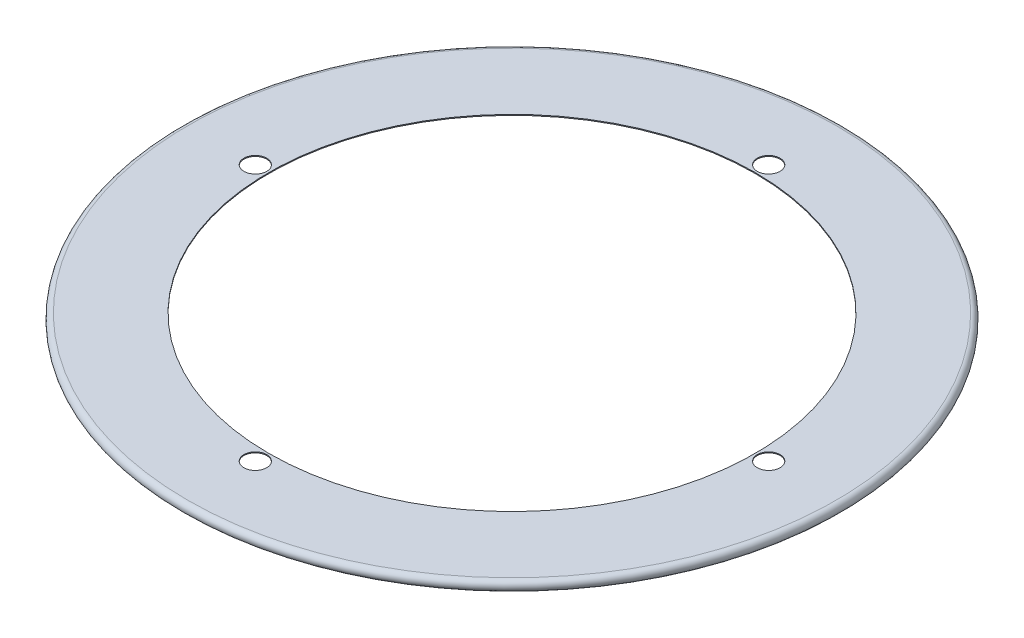
ISO-10303-21;
HEADER;
FILE_DESCRIPTION(('STEP AP214'),'2;1');
FILE_NAME('part.step','',(''),(''),'','','');
FILE_SCHEMA(('AUTOMOTIVE_DESIGN { 1 0 10303 214 1 1 1 1 }'));
ENDSEC;
DATA;
#1=APPLICATION_CONTEXT('core data for automotive mechanical design processes');
#2=APPLICATION_PROTOCOL_DEFINITION('international standard','automotive_design',2000,#1);
#3=PRODUCT_CONTEXT('',#1,'mechanical');
#4=PRODUCT('Part','Part','',(#3));
#5=PRODUCT_RELATED_PRODUCT_CATEGORY('part','',(#4));
#6=PRODUCT_DEFINITION_FORMATION('','',#4);
#7=PRODUCT_DEFINITION_CONTEXT('part definition',#1,'design');
#8=PRODUCT_DEFINITION('design','',#6,#7);
#9=PRODUCT_DEFINITION_SHAPE('','',#8);
#10=(LENGTH_UNIT() NAMED_UNIT(*) SI_UNIT(.MILLI.,.METRE.));
#11=(NAMED_UNIT(*) PLANE_ANGLE_UNIT() SI_UNIT($,.RADIAN.));
#12=(NAMED_UNIT(*) SI_UNIT($,.STERADIAN.) SOLID_ANGLE_UNIT());
#13=UNCERTAINTY_MEASURE_WITH_UNIT(LENGTH_MEASURE(1.E-05),#10,'distance_accuracy_value','');
#14=(GEOMETRIC_REPRESENTATION_CONTEXT(3) GLOBAL_UNCERTAINTY_ASSIGNED_CONTEXT((#13)) GLOBAL_UNIT_ASSIGNED_CONTEXT((#10,
#11,#12)) REPRESENTATION_CONTEXT('',''));
#15=CARTESIAN_POINT('',(0.,0.,0.));
#16=DIRECTION('',(0.,0.,1.));
#17=DIRECTION('',(1.,0.,0.));
#18=AXIS2_PLACEMENT_3D('',#15,#16,#17);
#19=CARTESIAN_POINT('',(152.4,0.,0.));
#20=DIRECTION('',(0.,1.,0.));
#21=DIRECTION('',(0.,0.,1.));
#22=AXIS2_PLACEMENT_3D('',#19,#20,#21);
#23=TOROIDAL_SURFACE('',#22,152.4,2.4638);
#24=CARTESIAN_POINT('',(152.4,-2.4638,0.));
#25=DIRECTION('',(0.,1.,0.));
#26=DIRECTION('',(0.,0.,1.));
#27=AXIS2_PLACEMENT_3D('',#24,#25,#26);
#28=CIRCLE('',#27,152.4);
#29=CARTESIAN_POINT('',(152.4,-2.4638,152.4));
#30=VERTEX_POINT('',#29);
#31=EDGE_CURVE('E12',#30,#30,#28,.T.);
#32=ORIENTED_EDGE('',*,*,#31,.T.);
#33=EDGE_LOOP('',(#32));
#34=FACE_BOUND('',#33,.T.);
#35=CARTESIAN_POINT('',(152.4,2.4638,0.));
#36=DIRECTION('',(0.,1.,0.));
#37=DIRECTION('',(0.,0.,1.));
#38=AXIS2_PLACEMENT_3D('',#35,#36,#37);
#39=CIRCLE('',#38,152.4);
#40=CARTESIAN_POINT('',(152.4,2.4638,152.4));
#41=VERTEX_POINT('',#40);
#42=EDGE_CURVE('E70',#41,#41,#39,.T.);
#43=ORIENTED_EDGE('',*,*,#42,.F.);
#44=EDGE_LOOP('',(#43));
#45=FACE_BOUND('',#44,.T.);
#46=ADVANCED_FACE('F42',(#34,#45),#23,.T.);
#47=CARTESIAN_POINT('',(14.9024415187753,-2.4638,0.));
#48=DIRECTION('',(0.,-1.,0.));
#49=DIRECTION('',(0.,0.,-1.));
#50=AXIS2_PLACEMENT_3D('',#47,#48,#49);
#51=PLANE('',#50);
#52=CARTESIAN_POINT('',(152.4,-2.4638,0.));
#53=DIRECTION('',(0.,1.,0.));
#54=DIRECTION('',(0.,0.,1.));
#55=AXIS2_PLACEMENT_3D('',#52,#53,#54);
#56=CIRCLE('',#55,137.497558481225);
#57=CARTESIAN_POINT('',(152.4,-2.4638,137.497558481225));
#58=VERTEX_POINT('',#57);
#59=EDGE_CURVE('E48',#58,#58,#56,.T.);
#60=ORIENTED_EDGE('',*,*,#59,.T.);
#61=EDGE_LOOP('',(#60));
#62=FACE_BOUND('',#61,.T.);
#63=ORIENTED_EDGE('',*,*,#31,.F.);
#64=EDGE_LOOP('',(#63));
#65=FACE_BOUND('',#64,.T.);
#66=ADVANCED_FACE('F144',(#62,#65),#51,.T.);
#67=CARTESIAN_POINT('',(152.4,15.515798554832,0.));
#68=DIRECTION('',(0.,1.,0.));
#69=DIRECTION('',(0.,0.,1.));
#70=AXIS2_PLACEMENT_3D('',#67,#68,#69);
#71=CYLINDRICAL_SURFACE('',#70,137.497558481225);
#72=CARTESIAN_POINT('',(152.4,-2.032,0.));
#73=DIRECTION('',(0.,1.,0.));
#74=DIRECTION('',(0.,0.,1.));
#75=AXIS2_PLACEMENT_3D('',#72,#73,#74);
#76=CIRCLE('',#75,137.497558481225);
#77=CARTESIAN_POINT('',(152.4,-2.032,137.497558481225));
#78=VERTEX_POINT('',#77);
#79=EDGE_CURVE('E52',#78,#78,#76,.T.);
#80=ORIENTED_EDGE('',*,*,#79,.T.);
#81=EDGE_LOOP('',(#80));
#82=FACE_BOUND('',#81,.T.);
#83=ORIENTED_EDGE('',*,*,#59,.F.);
#84=EDGE_LOOP('',(#83));
#85=FACE_BOUND('',#84,.T.);
#86=ADVANCED_FACE('F138',(#82,#85),#71,.F.);
#87=CARTESIAN_POINT('',(0.,-2.032,0.));
#88=DIRECTION('',(0.,1.,0.));
#89=DIRECTION('',(0.,0.,1.));
#90=AXIS2_PLACEMENT_3D('',#87,#88,#89);
#91=PLANE('',#90);
#92=CARTESIAN_POINT('',(152.4,-2.032,0.));
#93=DIRECTION('',(0.,1.,0.));
#94=DIRECTION('',(0.,0.,1.));
#95=AXIS2_PLACEMENT_3D('',#92,#93,#94);
#96=CIRCLE('',#95,152.4);
#97=CARTESIAN_POINT('',(152.4,-2.032,152.4));
#98=VERTEX_POINT('',#97);
#99=EDGE_CURVE('E56',#98,#98,#96,.T.);
#100=ORIENTED_EDGE('',*,*,#99,.T.);
#101=EDGE_LOOP('',(#100));
#102=FACE_BOUND('',#101,.T.);
#103=ORIENTED_EDGE('',*,*,#79,.F.);
#104=EDGE_LOOP('',(#103));
#105=FACE_BOUND('',#104,.T.);
#106=ADVANCED_FACE('F132',(#102,#105),#91,.T.);
#107=CARTESIAN_POINT('',(152.4,0.,0.));
#108=DIRECTION('',(0.,1.,0.));
#109=DIRECTION('',(0.,0.,1.));
#110=AXIS2_PLACEMENT_3D('',#107,#108,#109);
#111=TOROIDAL_SURFACE('',#110,152.4,2.032);
#112=CARTESIAN_POINT('',(152.4,2.032,0.));
#113=DIRECTION('',(0.,1.,0.));
#114=DIRECTION('',(0.,0.,1.));
#115=AXIS2_PLACEMENT_3D('',#112,#113,#114);
#116=CIRCLE('',#115,152.4);
#117=CARTESIAN_POINT('',(152.4,2.032,152.4));
#118=VERTEX_POINT('',#117);
#119=EDGE_CURVE('E61',#118,#118,#116,.T.);
#120=ORIENTED_EDGE('',*,*,#119,.T.);
#121=EDGE_LOOP('',(#120));
#122=FACE_BOUND('',#121,.T.);
#123=ORIENTED_EDGE('',*,*,#99,.F.);
#124=EDGE_LOOP('',(#123));
#125=FACE_BOUND('',#124,.T.);
#126=ADVANCED_FACE('F125',(#122,#125),#111,.F.);
#127=CARTESIAN_POINT('',(38.1,2.032,0.));
#128=DIRECTION('',(0.,-1.,0.));
#129=DIRECTION('',(0.,0.,-1.));
#130=AXIS2_PLACEMENT_3D('',#127,#128,#129);
#131=PLANE('',#130);
#132=CARTESIAN_POINT('',(273.016731480064,2.032,8.32770495544304E-13));
#133=DIRECTION('',(0.,-1.,0.));
#134=DIRECTION('',(0.,0.,-1.));
#135=AXIS2_PLACEMENT_3D('',#132,#133,#134);
#136=CIRCLE('',#135,5.36003335574986);
#137=CARTESIAN_POINT('',(273.016731480064,2.032,-5.36003335574903));
#138=VERTEX_POINT('',#137);
#139=EDGE_CURVE('E79',#138,#138,#136,.F.);
#140=ORIENTED_EDGE('',*,*,#139,.T.);
#141=EDGE_LOOP('',(#140));
#142=FACE_BOUND('',#141,.T.);
#143=CARTESIAN_POINT('',(152.4,2.032,-120.616731480064));
#144=DIRECTION('',(0.,-1.,0.));
#145=DIRECTION('',(0.,0.,-1.));
#146=AXIS2_PLACEMENT_3D('',#143,#144,#145);
#147=CIRCLE('',#146,5.36003335574987);
#148=CARTESIAN_POINT('',(152.4,2.032,-125.976764835814));
#149=VERTEX_POINT('',#148);
#150=EDGE_CURVE('E87',#149,#149,#147,.F.);
#151=ORIENTED_EDGE('',*,*,#150,.T.);
#152=EDGE_LOOP('',(#151));
#153=FACE_BOUND('',#152,.T.);
#154=CARTESIAN_POINT('',(152.399999999999,2.032,120.616731480064));
#155=DIRECTION('',(0.,-1.,0.));
#156=DIRECTION('',(0.,0.,-1.));
#157=AXIS2_PLACEMENT_3D('',#154,#155,#156);
#158=CIRCLE('',#157,5.36003335574987);
#159=CARTESIAN_POINT('',(152.399999999999,2.032,115.256698124314));
#160=VERTEX_POINT('',#159);
#161=EDGE_CURVE('E80',#160,#160,#158,.F.);
#162=ORIENTED_EDGE('',*,*,#161,.T.);
#163=EDGE_LOOP('',(#162));
#164=FACE_BOUND('',#163,.T.);
#165=CARTESIAN_POINT('',(31.7832685199361,2.032,0.));
#166=DIRECTION('',(0.,-1.,0.));
#167=DIRECTION('',(0.,0.,-1.));
#168=AXIS2_PLACEMENT_3D('',#165,#166,#167);
#169=CIRCLE('',#168,5.36003335574986);
#170=CARTESIAN_POINT('',(31.7832685199361,2.032,-5.36003335574986));
#171=VERTEX_POINT('',#170);
#172=EDGE_CURVE('E73',#171,#171,#169,.F.);
#173=ORIENTED_EDGE('',*,*,#172,.T.);
#174=EDGE_LOOP('',(#173));
#175=FACE_BOUND('',#174,.T.);
#176=CARTESIAN_POINT('',(152.4,2.032,0.));
#177=DIRECTION('',(0.,1.,0.));
#178=DIRECTION('',(0.,0.,1.));
#179=AXIS2_PLACEMENT_3D('',#176,#177,#178);
#180=CIRCLE('',#179,114.3);
#181=CARTESIAN_POINT('',(152.4,2.032,114.3));
#182=VERTEX_POINT('',#181);
#183=EDGE_CURVE('E64',#182,#182,#180,.T.);
#184=ORIENTED_EDGE('',*,*,#183,.T.);
#185=EDGE_LOOP('',(#184));
#186=FACE_BOUND('',#185,.T.);
#187=ORIENTED_EDGE('',*,*,#119,.F.);
#188=EDGE_LOOP('',(#187));
#189=FACE_BOUND('',#188,.T.);
#190=ADVANCED_FACE('F119',(#142,#153,#164,#175,#186,#189),#131,.T.);
#191=CARTESIAN_POINT('',(152.4,15.515798554832,0.));
#192=DIRECTION('',(0.,1.,0.));
#193=DIRECTION('',(0.,0.,1.));
#194=AXIS2_PLACEMENT_3D('',#191,#192,#193);
#195=CYLINDRICAL_SURFACE('',#194,114.3);
#196=CARTESIAN_POINT('',(152.4,2.4638,0.));
#197=DIRECTION('',(0.,1.,0.));
#198=DIRECTION('',(0.,0.,1.));
#199=AXIS2_PLACEMENT_3D('',#196,#197,#198);
#200=CIRCLE('',#199,114.3);
#201=CARTESIAN_POINT('',(152.4,2.4638,114.3));
#202=VERTEX_POINT('',#201);
#203=EDGE_CURVE('E67',#202,#202,#200,.T.);
#204=ORIENTED_EDGE('',*,*,#203,.T.);
#205=EDGE_LOOP('',(#204));
#206=FACE_BOUND('',#205,.T.);
#207=ORIENTED_EDGE('',*,*,#183,.F.);
#208=EDGE_LOOP('',(#207));
#209=FACE_BOUND('',#208,.T.);
#210=ADVANCED_FACE('F105',(#206,#209),#195,.F.);
#211=CARTESIAN_POINT('',(0.,2.4638,0.));
#212=DIRECTION('',(0.,1.,0.));
#213=DIRECTION('',(0.,0.,1.));
#214=AXIS2_PLACEMENT_3D('',#211,#212,#213);
#215=PLANE('',#214);
#216=CARTESIAN_POINT('',(273.016731480064,2.4638,8.32770495544304E-13));
#217=DIRECTION('',(0.,1.,0.));
#218=DIRECTION('',(0.,0.,1.));
#219=AXIS2_PLACEMENT_3D('',#216,#217,#218);
#220=CIRCLE('',#219,5.36003335574986);
#221=CARTESIAN_POINT('',(273.016731480064,2.4638,5.3600333557507));
#222=VERTEX_POINT('',#221);
#223=EDGE_CURVE('E90',#222,#222,#220,.T.);
#224=ORIENTED_EDGE('',*,*,#223,.F.);
#225=EDGE_LOOP('',(#224));
#226=FACE_BOUND('',#225,.T.);
#227=CARTESIAN_POINT('',(152.4,2.4638,-120.616731480064));
#228=DIRECTION('',(0.,1.,0.));
#229=DIRECTION('',(0.,0.,1.));
#230=AXIS2_PLACEMENT_3D('',#227,#228,#229);
#231=CIRCLE('',#230,5.36003335574987);
#232=CARTESIAN_POINT('',(152.4,2.4638,-115.256698124314));
#233=VERTEX_POINT('',#232);
#234=EDGE_CURVE('E83',#233,#233,#231,.T.);
#235=ORIENTED_EDGE('',*,*,#234,.F.);
#236=EDGE_LOOP('',(#235));
#237=FACE_BOUND('',#236,.T.);
#238=CARTESIAN_POINT('',(152.399999999999,2.4638,120.616731480064));
#239=DIRECTION('',(0.,1.,0.));
#240=DIRECTION('',(0.,0.,1.));
#241=AXIS2_PLACEMENT_3D('',#238,#239,#240);
#242=CIRCLE('',#241,5.36003335574987);
#243=CARTESIAN_POINT('',(152.399999999999,2.4638,125.976764835814));
#244=VERTEX_POINT('',#243);
#245=EDGE_CURVE('E84',#244,#244,#242,.T.);
#246=ORIENTED_EDGE('',*,*,#245,.F.);
#247=EDGE_LOOP('',(#246));
#248=FACE_BOUND('',#247,.T.);
#249=CARTESIAN_POINT('',(31.7832685199361,2.4638,0.));
#250=DIRECTION('',(0.,1.,0.));
#251=DIRECTION('',(0.,0.,1.));
#252=AXIS2_PLACEMENT_3D('',#249,#250,#251);
#253=CIRCLE('',#252,5.36003335574986);
#254=CARTESIAN_POINT('',(31.7832685199361,2.4638,5.36003335574986));
#255=VERTEX_POINT('',#254);
#256=EDGE_CURVE('E76',#255,#255,#253,.T.);
#257=ORIENTED_EDGE('',*,*,#256,.F.);
#258=EDGE_LOOP('',(#257));
#259=FACE_BOUND('',#258,.T.);
#260=ORIENTED_EDGE('',*,*,#42,.T.);
#261=EDGE_LOOP('',(#260));
#262=FACE_BOUND('',#261,.T.);
#263=ORIENTED_EDGE('',*,*,#203,.F.);
#264=EDGE_LOOP('',(#263));
#265=FACE_BOUND('',#264,.T.);
#266=ADVANCED_FACE('F101',(#226,#237,#248,#259,#262,#265),#215,.T.);
#267=CARTESIAN_POINT('',(31.7832685199361,-13.1284637329473,0.));
#268=DIRECTION('',(0.,1.,0.));
#269=DIRECTION('',(0.,0.,1.));
#270=AXIS2_PLACEMENT_3D('',#267,#268,#269);
#271=CYLINDRICAL_SURFACE('',#270,5.36003335574986);
#272=ORIENTED_EDGE('',*,*,#256,.T.);
#273=EDGE_LOOP('',(#272));
#274=FACE_BOUND('',#273,.T.);
#275=ORIENTED_EDGE('',*,*,#172,.F.);
#276=EDGE_LOOP('',(#275));
#277=FACE_BOUND('',#276,.T.);
#278=ADVANCED_FACE('F104',(#274,#277),#271,.F.);
#279=CARTESIAN_POINT('',(152.399999999999,-13.1284637329473,120.616731480064));
#280=DIRECTION('',(0.,1.,0.));
#281=DIRECTION('',(0.,0.,1.));
#282=AXIS2_PLACEMENT_3D('',#279,#280,#281);
#283=CYLINDRICAL_SURFACE('',#282,5.36003335574987);
#284=ORIENTED_EDGE('',*,*,#245,.T.);
#285=EDGE_LOOP('',(#284));
#286=FACE_BOUND('',#285,.T.);
#287=ORIENTED_EDGE('',*,*,#161,.F.);
#288=EDGE_LOOP('',(#287));
#289=FACE_BOUND('',#288,.T.);
#290=ADVANCED_FACE('F196',(#286,#289),#283,.F.);
#291=CARTESIAN_POINT('',(152.4,-13.1284637329473,-120.616731480064));
#292=DIRECTION('',(0.,1.,0.));
#293=DIRECTION('',(0.,0.,1.));
#294=AXIS2_PLACEMENT_3D('',#291,#292,#293);
#295=CYLINDRICAL_SURFACE('',#294,5.36003335574987);
#296=ORIENTED_EDGE('',*,*,#234,.T.);
#297=EDGE_LOOP('',(#296));
#298=FACE_BOUND('',#297,.T.);
#299=ORIENTED_EDGE('',*,*,#150,.F.);
#300=EDGE_LOOP('',(#299));
#301=FACE_BOUND('',#300,.T.);
#302=ADVANCED_FACE('F206',(#298,#301),#295,.F.);
#303=CARTESIAN_POINT('',(273.016731480064,-13.1284637329473,8.32770495544304E-13));
#304=DIRECTION('',(0.,1.,0.));
#305=DIRECTION('',(0.,0.,1.));
#306=AXIS2_PLACEMENT_3D('',#303,#304,#305);
#307=CYLINDRICAL_SURFACE('',#306,5.36003335574986);
#308=ORIENTED_EDGE('',*,*,#223,.T.);
#309=EDGE_LOOP('',(#308));
#310=FACE_BOUND('',#309,.T.);
#311=ORIENTED_EDGE('',*,*,#139,.F.);
#312=EDGE_LOOP('',(#311));
#313=FACE_BOUND('',#312,.T.);
#314=ADVANCED_FACE('F98',(#310,#313),#307,.F.);
#315=CLOSED_SHELL('',(#46,#66,#86,#106,#126,#190,#210,#266,#278,#290,#302,#314));
#316=MANIFOLD_SOLID_BREP('B2',#315);
#317=ADVANCED_BREP_SHAPE_REPRESENTATION('',(#18,#316),#14);
#318=SHAPE_DEFINITION_REPRESENTATION(#9,#317);
ENDSEC;
END-ISO-10303-21;
